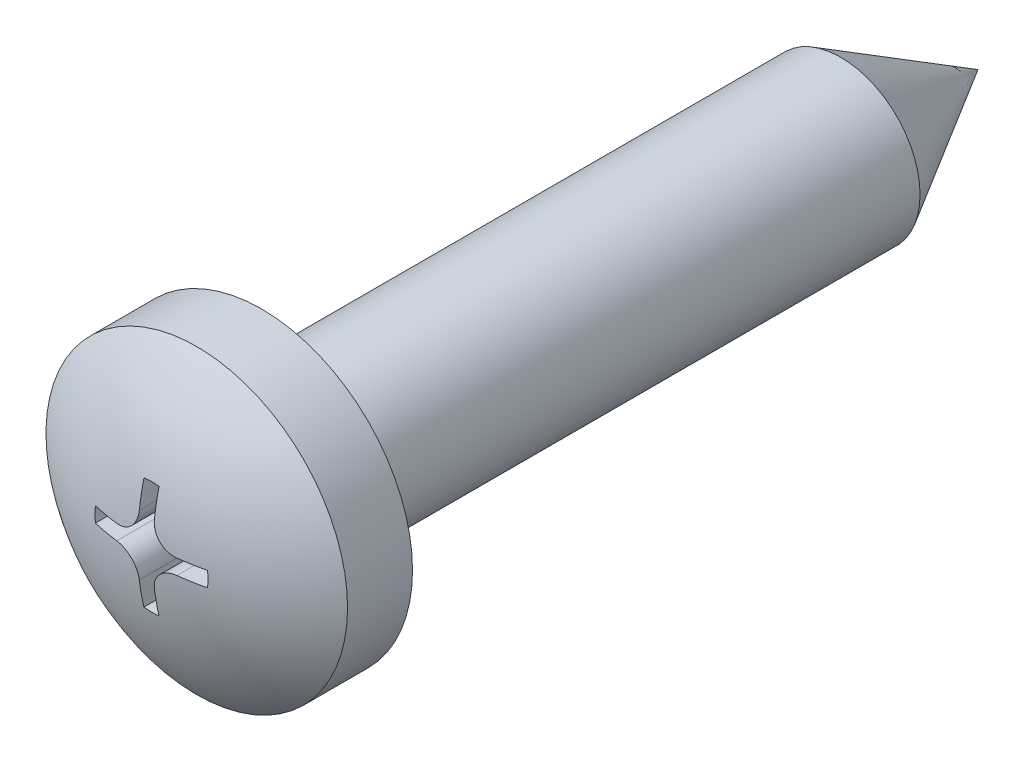
ISO-10303-21;
HEADER;
FILE_DESCRIPTION(('STEP AP214'),'2;1');
FILE_NAME('part.step','',(''),(''),'','','');
FILE_SCHEMA(('AUTOMOTIVE_DESIGN { 1 0 10303 214 1 1 1 1 }'));
ENDSEC;
DATA;
#1=APPLICATION_CONTEXT('core data for automotive mechanical design processes');
#2=APPLICATION_PROTOCOL_DEFINITION('international standard','automotive_design',2000,#1);
#3=PRODUCT_CONTEXT('',#1,'mechanical');
#4=PRODUCT('Part','Part','',(#3));
#5=PRODUCT_RELATED_PRODUCT_CATEGORY('part','',(#4));
#6=PRODUCT_DEFINITION_FORMATION('','',#4);
#7=PRODUCT_DEFINITION_CONTEXT('part definition',#1,'design');
#8=PRODUCT_DEFINITION('design','',#6,#7);
#9=PRODUCT_DEFINITION_SHAPE('','',#8);
#10=(LENGTH_UNIT() NAMED_UNIT(*) SI_UNIT(.MILLI.,.METRE.));
#11=(NAMED_UNIT(*) PLANE_ANGLE_UNIT() SI_UNIT($,.RADIAN.));
#12=(NAMED_UNIT(*) SI_UNIT($,.STERADIAN.) SOLID_ANGLE_UNIT());
#13=UNCERTAINTY_MEASURE_WITH_UNIT(LENGTH_MEASURE(1.E-05),#10,'distance_accuracy_value','');
#14=(GEOMETRIC_REPRESENTATION_CONTEXT(3) GLOBAL_UNCERTAINTY_ASSIGNED_CONTEXT((#13)) GLOBAL_UNIT_ASSIGNED_CONTEXT((#10,
#11,#12)) REPRESENTATION_CONTEXT('',''));
#15=CARTESIAN_POINT('',(0.,0.,0.));
#16=DIRECTION('',(0.,0.,1.));
#17=DIRECTION('',(1.,0.,0.));
#18=AXIS2_PLACEMENT_3D('',#15,#16,#17);
#19=CARTESIAN_POINT('',(0.,0.,15.6));
#20=DIRECTION('',(0.,0.,1.));
#21=DIRECTION('',(0.,1.,0.));
#22=AXIS2_PLACEMENT_3D('',#19,#20,#21);
#23=SPHERICAL_SURFACE('',#22,6.5);
#24=CARTESIAN_POINT('',(0.,0.,20.7234753829798));
#25=DIRECTION('',(0.,0.,1.));
#26=DIRECTION('',(1.,0.,0.));
#27=AXIS2_PLACEMENT_3D('',#24,#25,#26);
#28=CIRCLE('',#27,4.);
#29=CARTESIAN_POINT('',(4.,0.,20.7234753829798));
#30=VERTEX_POINT('',#29);
#31=EDGE_CURVE('E190',#30,#30,#28,.T.);
#32=ORIENTED_EDGE('',*,*,#31,.T.);
#33=EDGE_LOOP('',(#32));
#34=FACE_BOUND('',#33,.T.);
#35=CARTESIAN_POINT('',(0.,0.,21.9245553203368));
#36=DIRECTION('',(0.,0.,-1.));
#37=DIRECTION('',(-1.,0.,0.));
#38=AXIS2_PLACEMENT_3D('',#35,#36,#37);
#39=CIRCLE('',#38,1.5);
#40=CARTESIAN_POINT('',(0.200000000000001,1.48660687473185,21.9245553203368));
#41=VERTEX_POINT('',#40);
#42=CARTESIAN_POINT('',(-0.199999999999999,1.48660687473185,21.9245553203368));
#43=VERTEX_POINT('',#42);
#44=EDGE_CURVE('E298',#41,#43,#39,.F.);
#45=ORIENTED_EDGE('',*,*,#44,.F.);
#46=CARTESIAN_POINT('',(0.200000000000001,0.,15.6));
#47=DIRECTION('',(-1.,0.,0.));
#48=DIRECTION('',(0.,-1.,0.));
#49=AXIS2_PLACEMENT_3D('',#46,#47,#48);
#50=CIRCLE('',#49,6.49692234831231);
#51=CARTESIAN_POINT('',(0.200000000000001,0.797500009462237,22.0477898333388));
#52=VERTEX_POINT('',#51);
#53=EDGE_CURVE('E176',#52,#41,#50,.T.);
#54=ORIENTED_EDGE('',*,*,#53,.F.);
#55=CARTESIAN_POINT('',(0.200000033472805,0.797700009462237,22.0477650919923));
#56=CARTESIAN_POINT('',(0.199959598538046,0.764456004353227,22.0518818702258));
#57=CARTESIAN_POINT('',(0.202750817910161,0.731169020318814,22.0556498737768));
#58=CARTESIAN_POINT('',(0.213830211165421,0.665453235889728,22.0623958966436));
#59=CARTESIAN_POINT('',(0.222116339222608,0.633024120770341,22.065374209394));
#60=CARTESIAN_POINT('',(0.244028273409597,0.569916564069109,22.0704536695397));
#61=CARTESIAN_POINT('',(0.257658395246097,0.539239560456738,22.0725541051388));
#62=CARTESIAN_POINT('',(0.289878258314064,0.480568713011968,22.0758123837552));
#63=CARTESIAN_POINT('',(0.308466342272649,0.452573976833958,22.0769705412201));
#64=CARTESIAN_POINT('',(0.349911737553262,0.400290974802549,22.0783048224275));
#65=CARTESIAN_POINT('',(0.372733211862074,0.375974497150294,22.0784888323926));
#66=CARTESIAN_POINT('',(0.422095682936078,0.331472020678788,22.0778905404286));
#67=CARTESIAN_POINT('',(0.448637220387958,0.311286623335934,22.0771080979026));
#68=CARTESIAN_POINT('',(0.504567937063431,0.275683429833976,22.0746047654783));
#69=CARTESIAN_POINT('',(0.533946629751543,0.260248897721355,22.0728872302717));
#70=CARTESIAN_POINT('',(0.594792537452752,0.234466674321723,22.0685657182236));
#71=CARTESIAN_POINT('',(0.626259020814456,0.224117211583829,22.0659620506138));
#72=CARTESIAN_POINT('',(0.681170677081782,0.210961693981828,22.0608095234174));
#73=CARTESIAN_POINT('',(0.704329791582631,0.206843746812376,22.0584588663086));
#74=CARTESIAN_POINT('',(0.750897403889683,0.201358647922681,22.053383939786));
#75=CARTESIAN_POINT('',(0.774305499469382,0.199987586176354,22.0506602073353));
#76=CARTESIAN_POINT('',(0.797700009462238,0.200000033472804,22.0477650919923));
#77=B_SPLINE_CURVE_WITH_KNOTS('',3,(#55,#56,#57,#58,#59,#60,#61,#62,#63,#64,#65,#66,#67,#68,#69,
#70,#71,#72,#73,#74,#75,#76),.UNSPECIFIED.,.F.,.F.,(4,2,2,2,2,2,2,2,2,2,4),(0.,
0.100373633968193,0.200709918492538,0.301127400130332,0.401511357699248,0.501081398991604,
0.600665927170024,0.69989552274191,0.799090525824951,0.869853043391941,0.940514763005111),.UNSPECIFIED.);
#78=CARTESIAN_POINT('',(0.797500009462238,0.2,22.0477898333388));
#79=VERTEX_POINT('',#78);
#80=EDGE_CURVE('E288',#52,#79,#77,.T.);
#81=ORIENTED_EDGE('',*,*,#80,.T.);
#82=CARTESIAN_POINT('',(0.,0.200000000000002,15.6));
#83=DIRECTION('',(0.,1.,0.));
#84=DIRECTION('',(-1.,0.,0.));
#85=AXIS2_PLACEMENT_3D('',#82,#83,#84);
#86=CIRCLE('',#85,6.49692234831231);
#87=CARTESIAN_POINT('',(1.48660687473185,0.199999999999998,21.9245553203368));
#88=VERTEX_POINT('',#87);
#89=EDGE_CURVE('E296',#79,#88,#86,.T.);
#90=ORIENTED_EDGE('',*,*,#89,.T.);
#91=CARTESIAN_POINT('',(0.,0.,21.9245553203368));
#92=DIRECTION('',(0.,0.,-1.));
#93=DIRECTION('',(-1.,0.,0.));
#94=AXIS2_PLACEMENT_3D('',#91,#92,#93);
#95=CIRCLE('',#94,1.5);
#96=CARTESIAN_POINT('',(1.48660687473185,-0.199999999999998,21.9245553203368));
#97=VERTEX_POINT('',#96);
#98=EDGE_CURVE('E371',#88,#97,#95,.T.);
#99=ORIENTED_EDGE('',*,*,#98,.T.);
#100=CARTESIAN_POINT('',(0.,-0.200000000000002,15.6));
#101=DIRECTION('',(0.,1.,0.));
#102=DIRECTION('',(-1.,0.,0.));
#103=AXIS2_PLACEMENT_3D('',#100,#101,#102);
#104=CIRCLE('',#103,6.49692234831231);
#105=CARTESIAN_POINT('',(0.797500009462238,-0.2,22.0477898333388));
#106=VERTEX_POINT('',#105);
#107=EDGE_CURVE('E260',#106,#97,#104,.T.);
#108=ORIENTED_EDGE('',*,*,#107,.F.);
#109=CARTESIAN_POINT('',(0.200000033472805,-0.797700009462236,22.0477650919923));
#110=CARTESIAN_POINT('',(0.199959598538046,-0.764456004353227,22.0518818702258));
#111=CARTESIAN_POINT('',(0.202750817910161,-0.731169020318814,22.0556498737768));
#112=CARTESIAN_POINT('',(0.213830211165421,-0.665453235889727,22.0623958966436));
#113=CARTESIAN_POINT('',(0.222116339222608,-0.63302412077034,22.065374209394));
#114=CARTESIAN_POINT('',(0.244028273409597,-0.569916564069109,22.0704536695397));
#115=CARTESIAN_POINT('',(0.257658395246097,-0.539239560456737,22.0725541051388));
#116=CARTESIAN_POINT('',(0.289878258314064,-0.480568713011967,22.0758123837552));
#117=CARTESIAN_POINT('',(0.308466342272649,-0.452573976833957,22.0769705412201));
#118=CARTESIAN_POINT('',(0.349911737553262,-0.400290974802549,22.0783048224275));
#119=CARTESIAN_POINT('',(0.372733211862074,-0.375974497150293,22.0784888323926));
#120=CARTESIAN_POINT('',(0.422095682936078,-0.331472020678788,22.0778905404286));
#121=CARTESIAN_POINT('',(0.448637220387958,-0.311286623335934,22.0771080979026));
#122=CARTESIAN_POINT('',(0.504567937063432,-0.275683429833976,22.0746047654783));
#123=CARTESIAN_POINT('',(0.533946629751543,-0.260248897721355,22.0728872302717));
#124=CARTESIAN_POINT('',(0.594792537452753,-0.234466674321723,22.0685657182236));
#125=CARTESIAN_POINT('',(0.626259020814456,-0.224117211583829,22.0659620506138));
#126=CARTESIAN_POINT('',(0.681170677081783,-0.210961693981828,22.0608095234174));
#127=CARTESIAN_POINT('',(0.704329791582631,-0.206843746812376,22.0584588663086));
#128=CARTESIAN_POINT('',(0.750897403889683,-0.201358647922681,22.053383939786));
#129=CARTESIAN_POINT('',(0.774305499469382,-0.199987586176354,22.0506602073353));
#130=CARTESIAN_POINT('',(0.797700009462238,-0.200000033472804,22.0477650919923));
#131=B_SPLINE_CURVE_WITH_KNOTS('',3,(#109,#110,#111,#112,#113,#114,#115,#116,#117,#118,#119,
#120,#121,#122,#123,#124,#125,#126,#127,#128,#129,#130),.UNSPECIFIED.,.F.,.F.,(4,2,2,2,2,2,2,2,
2,2,4),(0.,0.100373633968193,0.200709918492538,0.301127400130332,0.401511357699248,
0.501081398991604,0.600665927170024,0.699895522741911,0.799090525824951,0.869853043391941,
0.94051476300511),.UNSPECIFIED.);
#132=CARTESIAN_POINT('',(0.200000000000001,-0.797500009462237,22.0477898333388));
#133=VERTEX_POINT('',#132);
#134=EDGE_CURVE('E253',#133,#106,#131,.T.);
#135=ORIENTED_EDGE('',*,*,#134,.F.);
#136=CARTESIAN_POINT('',(0.200000000000001,0.,15.6));
#137=DIRECTION('',(1.,0.,0.));
#138=DIRECTION('',(0.,1.,0.));
#139=AXIS2_PLACEMENT_3D('',#136,#137,#138);
#140=CIRCLE('',#139,6.49692234831231);
#141=CARTESIAN_POINT('',(0.200000000000001,-1.48660687473185,21.9245553203368));
#142=VERTEX_POINT('',#141);
#143=EDGE_CURVE('E250',#133,#142,#140,.T.);
#144=ORIENTED_EDGE('',*,*,#143,.T.);
#145=CARTESIAN_POINT('',(0.,0.,21.9245553203368));
#146=DIRECTION('',(0.,0.,-1.));
#147=DIRECTION('',(-1.,0.,0.));
#148=AXIS2_PLACEMENT_3D('',#145,#146,#147);
#149=CIRCLE('',#148,1.5);
#150=CARTESIAN_POINT('',(-0.199999999999999,-1.48660687473185,21.9245553203368));
#151=VERTEX_POINT('',#150);
#152=EDGE_CURVE('E247',#142,#151,#149,.T.);
#153=ORIENTED_EDGE('',*,*,#152,.T.);
#154=CARTESIAN_POINT('',(-0.2,0.,15.6));
#155=DIRECTION('',(1.,0.,0.));
#156=DIRECTION('',(0.,1.,0.));
#157=AXIS2_PLACEMENT_3D('',#154,#155,#156);
#158=CIRCLE('',#157,6.49692234831231);
#159=CARTESIAN_POINT('',(-0.2,-0.797500009462236,22.0477898333388));
#160=VERTEX_POINT('',#159);
#161=EDGE_CURVE('E244',#160,#151,#158,.T.);
#162=ORIENTED_EDGE('',*,*,#161,.F.);
#163=CARTESIAN_POINT('',(-0.200000033472803,-0.797700009462235,22.0477650919923));
#164=CARTESIAN_POINT('',(-0.199959598538045,-0.764456004353225,22.0518818702258));
#165=CARTESIAN_POINT('',(-0.20275081791016,-0.731169020318813,22.0556498737768));
#166=CARTESIAN_POINT('',(-0.21383021116542,-0.665453235889726,22.0623958966436));
#167=CARTESIAN_POINT('',(-0.222116339222606,-0.63302412077034,22.065374209394));
#168=CARTESIAN_POINT('',(-0.244028273409595,-0.569916564069108,22.0704536695397));
#169=CARTESIAN_POINT('',(-0.257658395246095,-0.539239560456737,22.0725541051388));
#170=CARTESIAN_POINT('',(-0.289878258314063,-0.480568713011967,22.0758123837552));
#171=CARTESIAN_POINT('',(-0.308466342272648,-0.452573976833956,22.0769705412201));
#172=CARTESIAN_POINT('',(-0.349911737553261,-0.400290974802548,22.0783048224275));
#173=CARTESIAN_POINT('',(-0.372733211862072,-0.375974497150293,22.0784888323926));
#174=CARTESIAN_POINT('',(-0.422095682936076,-0.331472020678787,22.0778905404286));
#175=CARTESIAN_POINT('',(-0.448637220387957,-0.311286623335933,22.0771080979026));
#176=CARTESIAN_POINT('',(-0.50456793706343,-0.275683429833975,22.0746047654783));
#177=CARTESIAN_POINT('',(-0.533946629751542,-0.260248897721354,22.0728872302717));
#178=CARTESIAN_POINT('',(-0.594792537452751,-0.234466674321722,22.0685657182236));
#179=CARTESIAN_POINT('',(-0.626259020814454,-0.224117211583829,22.0659620506138));
#180=CARTESIAN_POINT('',(-0.681170677081781,-0.210961693981827,22.0608095234174));
#181=CARTESIAN_POINT('',(-0.704329791582629,-0.206843746812375,22.0584588663086));
#182=CARTESIAN_POINT('',(-0.750897403889681,-0.20135864792268,22.053383939786));
#183=CARTESIAN_POINT('',(-0.774305499469379,-0.199987586176354,22.0506602073353));
#184=CARTESIAN_POINT('',(-0.797700009462236,-0.200000033472803,22.0477650919923));
#185=B_SPLINE_CURVE_WITH_KNOTS('',3,(#163,#164,#165,#166,#167,#168,#169,#170,#171,#172,#173,
#174,#175,#176,#177,#178,#179,#180,#181,#182,#183,#184),.UNSPECIFIED.,.F.,.F.,(4,2,2,2,2,2,2,2,
2,2,4),(0.,0.100373633968193,0.200709918492537,0.301127400130332,0.401511357699248,
0.501081398991604,0.600665927170024,0.69989552274191,0.79909052582495,0.86985304339194,
0.940514763005109),.UNSPECIFIED.);
#186=CARTESIAN_POINT('',(-0.797500009462236,-0.199999999999999,22.0477898333388));
#187=VERTEX_POINT('',#186);
#188=EDGE_CURVE('E236',#160,#187,#185,.T.);
#189=ORIENTED_EDGE('',*,*,#188,.T.);
#190=CARTESIAN_POINT('',(0.,-0.2,15.6));
#191=DIRECTION('',(0.,-1.,0.));
#192=DIRECTION('',(1.,0.,0.));
#193=AXIS2_PLACEMENT_3D('',#190,#191,#192);
#194=CIRCLE('',#193,6.49692234831231);
#195=CARTESIAN_POINT('',(-1.48660687473185,-0.199999999999999,21.9245553203368));
#196=VERTEX_POINT('',#195);
#197=EDGE_CURVE('E245',#187,#196,#194,.T.);
#198=ORIENTED_EDGE('',*,*,#197,.T.);
#199=CARTESIAN_POINT('',(0.,0.,21.9245553203368));
#200=DIRECTION('',(0.,0.,-1.));
#201=DIRECTION('',(-1.,0.,0.));
#202=AXIS2_PLACEMENT_3D('',#199,#200,#201);
#203=CIRCLE('',#202,1.5);
#204=CARTESIAN_POINT('',(-1.48660687473185,0.199999999999999,21.9245553203368));
#205=VERTEX_POINT('',#204);
#206=EDGE_CURVE('E410',#205,#196,#203,.F.);
#207=ORIENTED_EDGE('',*,*,#206,.F.);
#208=CARTESIAN_POINT('',(0.,0.2,15.6));
#209=DIRECTION('',(0.,-1.,0.));
#210=DIRECTION('',(1.,0.,0.));
#211=AXIS2_PLACEMENT_3D('',#208,#209,#210);
#212=CIRCLE('',#211,6.49692234831231);
#213=CARTESIAN_POINT('',(-0.797500009462236,0.199999999999999,22.0477898333388));
#214=VERTEX_POINT('',#213);
#215=EDGE_CURVE('E204',#214,#205,#212,.T.);
#216=ORIENTED_EDGE('',*,*,#215,.F.);
#217=CARTESIAN_POINT('',(-0.200000033472804,0.797700009462236,22.0477650919923));
#218=CARTESIAN_POINT('',(-0.199959598538045,0.764456004353226,22.0518818702258));
#219=CARTESIAN_POINT('',(-0.20275081791016,0.731169020318813,22.0556498737768));
#220=CARTESIAN_POINT('',(-0.21383021116542,0.665453235889727,22.0623958966436));
#221=CARTESIAN_POINT('',(-0.222116339222606,0.63302412077034,22.065374209394));
#222=CARTESIAN_POINT('',(-0.244028273409595,0.569916564069108,22.0704536695397));
#223=CARTESIAN_POINT('',(-0.257658395246095,0.539239560456737,22.0725541051388));
#224=CARTESIAN_POINT('',(-0.289878258314063,0.480568713011967,22.0758123837552));
#225=CARTESIAN_POINT('',(-0.308466342272648,0.452573976833957,22.0769705412201));
#226=CARTESIAN_POINT('',(-0.349911737553261,0.400290974802548,22.0783048224275));
#227=CARTESIAN_POINT('',(-0.372733211862072,0.375974497150293,22.0784888323926));
#228=CARTESIAN_POINT('',(-0.422095682936076,0.331472020678787,22.0778905404286));
#229=CARTESIAN_POINT('',(-0.448637220387957,0.311286623335933,22.0771080979026));
#230=CARTESIAN_POINT('',(-0.50456793706343,0.275683429833975,22.0746047654783));
#231=CARTESIAN_POINT('',(-0.533946629751542,0.260248897721354,22.0728872302717));
#232=CARTESIAN_POINT('',(-0.594792537452751,0.234466674321722,22.0685657182236));
#233=CARTESIAN_POINT('',(-0.626259020814454,0.224117211583828,22.0659620506138));
#234=CARTESIAN_POINT('',(-0.681170677081781,0.210961693981827,22.0608095234174));
#235=CARTESIAN_POINT('',(-0.704329791582629,0.206843746812375,22.0584588663086));
#236=CARTESIAN_POINT('',(-0.750897403889681,0.20135864792268,22.053383939786));
#237=CARTESIAN_POINT('',(-0.774305499469379,0.199987586176354,22.0506602073353));
#238=CARTESIAN_POINT('',(-0.797700009462236,0.200000033472803,22.0477650919923));
#239=B_SPLINE_CURVE_WITH_KNOTS('',3,(#217,#218,#219,#220,#221,#222,#223,#224,#225,#226,#227,
#228,#229,#230,#231,#232,#233,#234,#235,#236,#237,#238),.UNSPECIFIED.,.F.,.F.,(4,2,2,2,2,2,2,2,
2,2,4),(0.,0.100373633968193,0.200709918492538,0.301127400130332,0.401511357699248,
0.501081398991604,0.600665927170024,0.69989552274191,0.799090525824951,0.869853043391941,
0.940514763005109),.UNSPECIFIED.);
#240=CARTESIAN_POINT('',(-0.2,0.797500009462236,22.0477898333388));
#241=VERTEX_POINT('',#240);
#242=EDGE_CURVE('E196',#241,#214,#239,.T.);
#243=ORIENTED_EDGE('',*,*,#242,.F.);
#244=CARTESIAN_POINT('',(-0.2,0.,15.6));
#245=DIRECTION('',(-1.,0.,0.));
#246=DIRECTION('',(0.,-1.,0.));
#247=AXIS2_PLACEMENT_3D('',#244,#245,#246);
#248=CIRCLE('',#247,6.49692234831231);
#249=EDGE_CURVE('E193',#241,#43,#248,.T.);
#250=ORIENTED_EDGE('',*,*,#249,.T.);
#251=EDGE_LOOP('',(#45,#54,#81,#90,#99,#108,#135,#144,#153,#162,#189,#198,#207,#216,#243,#250));
#252=FACE_BOUND('',#251,.T.);
#253=ADVANCED_FACE('F41',(#34,#252),#23,.T.);
#254=CARTESIAN_POINT('',(0.,0.,0.));
#255=DIRECTION('',(0.,0.,1.));
#256=DIRECTION('',(1.,0.,0.));
#257=AXIS2_PLACEMENT_3D('',#254,#255,#256);
#258=CONICAL_SURFACE('',#257,0.,0.523598775598293);
#259=CARTESIAN_POINT('',(0.,0.,3.63730669589469));
#260=DIRECTION('',(0.,0.,1.));
#261=DIRECTION('',(1.,0.,0.));
#262=AXIS2_PLACEMENT_3D('',#259,#260,#261);
#263=CIRCLE('',#262,2.1);
#264=CARTESIAN_POINT('',(2.1,0.,3.63730669589469));
#265=VERTEX_POINT('',#264);
#266=EDGE_CURVE('E177',#265,#265,#263,.T.);
#267=ORIENTED_EDGE('',*,*,#266,.F.);
#268=EDGE_LOOP('',(#267));
#269=FACE_BOUND('',#268,.T.);
#270=CARTESIAN_POINT('',(0.,0.,0.));
#271=VERTEX_POINT('',#270);
#272=VERTEX_LOOP('',#271);
#273=FACE_BOUND('',#272,.T.);
#274=ADVANCED_FACE('F312',(#269,#273),#258,.T.);
#275=CARTESIAN_POINT('',(0.,0.,11.71));
#276=DIRECTION('',(0.,0.,1.));
#277=DIRECTION('',(1.,0.,0.));
#278=AXIS2_PLACEMENT_3D('',#275,#276,#277);
#279=CYLINDRICAL_SURFACE('',#278,4.);
#280=ORIENTED_EDGE('',*,*,#31,.F.);
#281=EDGE_LOOP('',(#280));
#282=FACE_BOUND('',#281,.T.);
#283=CARTESIAN_POINT('',(0.,0.,19.));
#284=DIRECTION('',(0.,0.,1.));
#285=DIRECTION('',(1.,0.,0.));
#286=AXIS2_PLACEMENT_3D('',#283,#284,#285);
#287=CIRCLE('',#286,4.);
#288=CARTESIAN_POINT('',(4.,0.,19.));
#289=VERTEX_POINT('',#288);
#290=EDGE_CURVE('E181',#289,#289,#287,.T.);
#291=ORIENTED_EDGE('',*,*,#290,.T.);
#292=EDGE_LOOP('',(#291));
#293=FACE_BOUND('',#292,.T.);
#294=ADVANCED_FACE('F317',(#282,#293),#279,.T.);
#295=CARTESIAN_POINT('',(0.,4.,19.));
#296=DIRECTION('',(0.,0.,1.));
#297=DIRECTION('',(1.,0.,0.));
#298=AXIS2_PLACEMENT_3D('',#295,#296,#297);
#299=PLANE('',#298);
#300=CARTESIAN_POINT('',(0.,0.,19.));
#301=DIRECTION('',(0.,0.,1.));
#302=DIRECTION('',(1.,0.,0.));
#303=AXIS2_PLACEMENT_3D('',#300,#301,#302);
#304=CIRCLE('',#303,2.3);
#305=CARTESIAN_POINT('',(2.3,0.,19.));
#306=VERTEX_POINT('',#305);
#307=EDGE_CURVE('E50',#306,#306,#304,.T.);
#308=ORIENTED_EDGE('',*,*,#307,.T.);
#309=EDGE_LOOP('',(#308));
#310=FACE_BOUND('',#309,.T.);
#311=ORIENTED_EDGE('',*,*,#290,.F.);
#312=EDGE_LOOP('',(#311));
#313=FACE_BOUND('',#312,.T.);
#314=ADVANCED_FACE('F302',(#310,#313),#299,.F.);
#315=CARTESIAN_POINT('',(0.,0.,11.71));
#316=DIRECTION('',(0.,0.,1.));
#317=DIRECTION('',(1.,0.,0.));
#318=AXIS2_PLACEMENT_3D('',#315,#316,#317);
#319=CYLINDRICAL_SURFACE('',#318,2.1);
#320=CARTESIAN_POINT('',(0.,0.,18.8));
#321=DIRECTION('',(0.,0.,1.));
#322=DIRECTION('',(1.,0.,0.));
#323=AXIS2_PLACEMENT_3D('',#320,#321,#322);
#324=CIRCLE('',#323,2.1);
#325=CARTESIAN_POINT('',(2.1,0.,18.8));
#326=VERTEX_POINT('',#325);
#327=EDGE_CURVE('E11',#326,#326,#324,.F.);
#328=ORIENTED_EDGE('',*,*,#327,.T.);
#329=EDGE_LOOP('',(#328));
#330=FACE_BOUND('',#329,.T.);
#331=ORIENTED_EDGE('',*,*,#266,.T.);
#332=EDGE_LOOP('',(#331));
#333=FACE_BOUND('',#332,.T.);
#334=ADVANCED_FACE('F464',(#330,#333),#319,.T.);
#335=CARTESIAN_POINT('',(0.,0.,20.3));
#336=DIRECTION('',(0.,0.,1.));
#337=DIRECTION('',(1.,0.,0.));
#338=AXIS2_PLACEMENT_3D('',#335,#336,#337);
#339=CYLINDRICAL_SURFACE('',#338,1.5);
#340=ORIENTED_EDGE('',*,*,#44,.T.);
#341=DIRECTION('',(0.,0.,1.));
#342=VECTOR('',#341,1.);
#343=CARTESIAN_POINT('',(-0.199999999999999,1.48660687473185,20.3));
#344=LINE('',#343,#342);
#345=CARTESIAN_POINT('',(-0.199999999999999,1.48660687473185,20.3));
#346=VERTEX_POINT('',#345);
#347=EDGE_CURVE('E57',#346,#43,#344,.T.);
#348=ORIENTED_EDGE('',*,*,#347,.F.);
#349=CARTESIAN_POINT('',(0.,0.,20.3));
#350=DIRECTION('',(0.,0.,-1.));
#351=DIRECTION('',(-1.,0.,0.));
#352=AXIS2_PLACEMENT_3D('',#349,#350,#351);
#353=CIRCLE('',#352,1.5);
#354=CARTESIAN_POINT('',(0.200000000000001,1.48660687473185,20.3));
#355=VERTEX_POINT('',#354);
#356=EDGE_CURVE('E159',#346,#355,#353,.T.);
#357=ORIENTED_EDGE('',*,*,#356,.T.);
#358=DIRECTION('',(0.,0.,1.));
#359=VECTOR('',#358,1.);
#360=CARTESIAN_POINT('',(0.200000000000001,1.48660687473185,20.3));
#361=LINE('',#360,#359);
#362=EDGE_CURVE('E171',#355,#41,#361,.T.);
#363=ORIENTED_EDGE('',*,*,#362,.T.);
#364=EDGE_LOOP('',(#340,#348,#357,#363));
#365=FACE_BOUND('',#364,.T.);
#366=ADVANCED_FACE('F170',(#365),#339,.F.);
#367=CARTESIAN_POINT('',(0.200000000000001,1.48660687473185,20.3));
#368=DIRECTION('',(-1.,0.,0.));
#369=DIRECTION('',(0.,-1.,0.));
#370=AXIS2_PLACEMENT_3D('',#367,#368,#369);
#371=PLANE('',#370);
#372=ORIENTED_EDGE('',*,*,#53,.T.);
#373=ORIENTED_EDGE('',*,*,#362,.F.);
#374=DIRECTION('',(0.,-1.,0.));
#375=VECTOR('',#374,1.);
#376=CARTESIAN_POINT('',(0.200000000000001,1.48660687473185,20.3));
#377=LINE('',#376,#375);
#378=CARTESIAN_POINT('',(0.200000000000001,0.797500009462237,20.3));
#379=VERTEX_POINT('',#378);
#380=EDGE_CURVE('E155',#355,#379,#377,.T.);
#381=ORIENTED_EDGE('',*,*,#380,.T.);
#382=DIRECTION('',(0.,0.,1.));
#383=VECTOR('',#382,1.);
#384=CARTESIAN_POINT('',(0.200000000000001,0.797500009462237,20.3));
#385=LINE('',#384,#383);
#386=EDGE_CURVE('E178',#379,#52,#385,.T.);
#387=ORIENTED_EDGE('',*,*,#386,.T.);
#388=EDGE_LOOP('',(#372,#373,#381,#387));
#389=FACE_BOUND('',#388,.T.);
#390=ADVANCED_FACE('F174',(#389),#371,.T.);
#391=CARTESIAN_POINT('',(0.797500009462238,0.797500009462237,20.3));
#392=DIRECTION('',(0.,0.,1.));
#393=DIRECTION('',(1.,0.,0.));
#394=AXIS2_PLACEMENT_3D('',#391,#392,#393);
#395=CYLINDRICAL_SURFACE('',#394,0.597500009462237);
#396=ORIENTED_EDGE('',*,*,#386,.F.);
#397=CARTESIAN_POINT('',(0.797500009462238,0.797500009462237,20.3));
#398=DIRECTION('',(0.,0.,-1.));
#399=DIRECTION('',(-1.,0.,0.));
#400=AXIS2_PLACEMENT_3D('',#397,#398,#399);
#401=CIRCLE('',#400,0.597500009462237);
#402=CARTESIAN_POINT('',(0.797500009462238,0.2,20.3));
#403=VERTEX_POINT('',#402);
#404=EDGE_CURVE('E162',#403,#379,#401,.T.);
#405=ORIENTED_EDGE('',*,*,#404,.F.);
#406=DIRECTION('',(0.,0.,1.));
#407=VECTOR('',#406,1.);
#408=CARTESIAN_POINT('',(0.797500009462238,0.2,20.3));
#409=LINE('',#408,#407);
#410=EDGE_CURVE('E183',#403,#79,#409,.T.);
#411=ORIENTED_EDGE('',*,*,#410,.T.);
#412=ORIENTED_EDGE('',*,*,#80,.F.);
#413=EDGE_LOOP('',(#396,#405,#411,#412));
#414=FACE_BOUND('',#413,.T.);
#415=ADVANCED_FACE('F280',(#414),#395,.T.);
#416=CARTESIAN_POINT('',(1.48660687473185,0.199999999999998,20.3));
#417=DIRECTION('',(0.,1.,0.));
#418=DIRECTION('',(-1.,0.,0.));
#419=AXIS2_PLACEMENT_3D('',#416,#417,#418);
#420=PLANE('',#419);
#421=ORIENTED_EDGE('',*,*,#410,.F.);
#422=DIRECTION('',(-1.,0.,0.));
#423=VECTOR('',#422,1.);
#424=CARTESIAN_POINT('',(1.48660687473185,0.199999999999998,20.3));
#425=LINE('',#424,#423);
#426=CARTESIAN_POINT('',(1.48660687473185,0.199999999999998,20.3));
#427=VERTEX_POINT('',#426);
#428=EDGE_CURVE('E379',#427,#403,#425,.T.);
#429=ORIENTED_EDGE('',*,*,#428,.F.);
#430=DIRECTION('',(0.,0.,1.));
#431=VECTOR('',#430,1.);
#432=CARTESIAN_POINT('',(1.48660687473185,0.199999999999998,20.3));
#433=LINE('',#432,#431);
#434=EDGE_CURVE('E364',#427,#88,#433,.T.);
#435=ORIENTED_EDGE('',*,*,#434,.T.);
#436=ORIENTED_EDGE('',*,*,#89,.F.);
#437=EDGE_LOOP('',(#421,#429,#435,#436));
#438=FACE_BOUND('',#437,.T.);
#439=ADVANCED_FACE('F276',(#438),#420,.F.);
#440=CARTESIAN_POINT('',(0.,0.,20.3));
#441=DIRECTION('',(0.,0.,1.));
#442=DIRECTION('',(1.,0.,0.));
#443=AXIS2_PLACEMENT_3D('',#440,#441,#442);
#444=CYLINDRICAL_SURFACE('',#443,1.5);
#445=ORIENTED_EDGE('',*,*,#434,.F.);
#446=CARTESIAN_POINT('',(0.,0.,20.3));
#447=DIRECTION('',(0.,0.,1.));
#448=DIRECTION('',(1.,0.,0.));
#449=AXIS2_PLACEMENT_3D('',#446,#447,#448);
#450=CIRCLE('',#449,1.5);
#451=CARTESIAN_POINT('',(1.48660687473185,-0.199999999999999,20.3));
#452=VERTEX_POINT('',#451);
#453=EDGE_CURVE('E377',#452,#427,#450,.T.);
#454=ORIENTED_EDGE('',*,*,#453,.F.);
#455=DIRECTION('',(0.,0.,1.));
#456=VECTOR('',#455,1.);
#457=CARTESIAN_POINT('',(1.48660687473185,-0.199999999999999,20.3));
#458=LINE('',#457,#456);
#459=EDGE_CURVE('E361',#452,#97,#458,.T.);
#460=ORIENTED_EDGE('',*,*,#459,.T.);
#461=ORIENTED_EDGE('',*,*,#98,.F.);
#462=EDGE_LOOP('',(#445,#454,#460,#461));
#463=FACE_BOUND('',#462,.T.);
#464=ADVANCED_FACE('F272',(#463),#444,.F.);
#465=CARTESIAN_POINT('',(1.48660687473185,-0.199999999999998,20.3));
#466=DIRECTION('',(0.,1.,0.));
#467=DIRECTION('',(-1.,0.,0.));
#468=AXIS2_PLACEMENT_3D('',#465,#466,#467);
#469=PLANE('',#468);
#470=ORIENTED_EDGE('',*,*,#107,.T.);
#471=ORIENTED_EDGE('',*,*,#459,.F.);
#472=DIRECTION('',(-1.,0.,0.));
#473=VECTOR('',#472,1.);
#474=CARTESIAN_POINT('',(1.48660687473185,-0.199999999999998,20.3));
#475=LINE('',#474,#473);
#476=CARTESIAN_POINT('',(0.797500009462238,-0.2,20.3));
#477=VERTEX_POINT('',#476);
#478=EDGE_CURVE('E378',#452,#477,#475,.T.);
#479=ORIENTED_EDGE('',*,*,#478,.T.);
#480=DIRECTION('',(0.,0.,1.));
#481=VECTOR('',#480,1.);
#482=CARTESIAN_POINT('',(0.797500009462238,-0.2,20.3));
#483=LINE('',#482,#481);
#484=EDGE_CURVE('E358',#477,#106,#483,.T.);
#485=ORIENTED_EDGE('',*,*,#484,.T.);
#486=EDGE_LOOP('',(#470,#471,#479,#485));
#487=FACE_BOUND('',#486,.T.);
#488=ADVANCED_FACE('F268',(#487),#469,.T.);
#489=CARTESIAN_POINT('',(0.797500009462238,-0.797500009462237,20.3));
#490=DIRECTION('',(0.,0.,1.));
#491=DIRECTION('',(1.,0.,0.));
#492=AXIS2_PLACEMENT_3D('',#489,#490,#491);
#493=CYLINDRICAL_SURFACE('',#492,0.597500009462237);
#494=ORIENTED_EDGE('',*,*,#134,.T.);
#495=ORIENTED_EDGE('',*,*,#484,.F.);
#496=CARTESIAN_POINT('',(0.797500009462238,-0.797500009462237,20.3));
#497=DIRECTION('',(0.,0.,1.));
#498=DIRECTION('',(1.,0.,0.));
#499=AXIS2_PLACEMENT_3D('',#496,#497,#498);
#500=CIRCLE('',#499,0.597500009462237);
#501=CARTESIAN_POINT('',(0.200000000000001,-0.797500009462237,20.3));
#502=VERTEX_POINT('',#501);
#503=EDGE_CURVE('E381',#477,#502,#500,.T.);
#504=ORIENTED_EDGE('',*,*,#503,.T.);
#505=DIRECTION('',(0.,0.,1.));
#506=VECTOR('',#505,1.);
#507=CARTESIAN_POINT('',(0.200000000000001,-0.797500009462237,20.3));
#508=LINE('',#507,#506);
#509=EDGE_CURVE('E355',#502,#133,#508,.T.);
#510=ORIENTED_EDGE('',*,*,#509,.T.);
#511=EDGE_LOOP('',(#494,#495,#504,#510));
#512=FACE_BOUND('',#511,.T.);
#513=ADVANCED_FACE('F262',(#512),#493,.T.);
#514=CARTESIAN_POINT('',(0.200000000000001,-1.48660687473185,20.3));
#515=DIRECTION('',(1.,0.,0.));
#516=DIRECTION('',(0.,1.,0.));
#517=AXIS2_PLACEMENT_3D('',#514,#515,#516);
#518=PLANE('',#517);
#519=ORIENTED_EDGE('',*,*,#509,.F.);
#520=DIRECTION('',(0.,1.,0.));
#521=VECTOR('',#520,1.);
#522=CARTESIAN_POINT('',(0.200000000000001,-1.48660687473185,20.3));
#523=LINE('',#522,#521);
#524=CARTESIAN_POINT('',(0.200000000000001,-1.48660687473185,20.3));
#525=VERTEX_POINT('',#524);
#526=EDGE_CURVE('E387',#525,#502,#523,.T.);
#527=ORIENTED_EDGE('',*,*,#526,.F.);
#528=DIRECTION('',(0.,0.,1.));
#529=VECTOR('',#528,1.);
#530=CARTESIAN_POINT('',(0.200000000000001,-1.48660687473185,20.3));
#531=LINE('',#530,#529);
#532=EDGE_CURVE('E352',#525,#142,#531,.T.);
#533=ORIENTED_EDGE('',*,*,#532,.T.);
#534=ORIENTED_EDGE('',*,*,#143,.F.);
#535=EDGE_LOOP('',(#519,#527,#533,#534));
#536=FACE_BOUND('',#535,.T.);
#537=ADVANCED_FACE('F267',(#536),#518,.F.);
#538=CARTESIAN_POINT('',(0.,0.,20.3));
#539=DIRECTION('',(0.,0.,1.));
#540=DIRECTION('',(1.,0.,0.));
#541=AXIS2_PLACEMENT_3D('',#538,#539,#540);
#542=CYLINDRICAL_SURFACE('',#541,1.5);
#543=ORIENTED_EDGE('',*,*,#532,.F.);
#544=CARTESIAN_POINT('',(0.,0.,20.3));
#545=DIRECTION('',(0.,0.,1.));
#546=DIRECTION('',(1.,0.,0.));
#547=AXIS2_PLACEMENT_3D('',#544,#545,#546);
#548=CIRCLE('',#547,1.5);
#549=CARTESIAN_POINT('',(-0.2,-1.48660687473185,20.3));
#550=VERTEX_POINT('',#549);
#551=EDGE_CURVE('E390',#550,#525,#548,.T.);
#552=ORIENTED_EDGE('',*,*,#551,.F.);
#553=DIRECTION('',(0.,0.,1.));
#554=VECTOR('',#553,1.);
#555=CARTESIAN_POINT('',(-0.2,-1.48660687473185,20.3));
#556=LINE('',#555,#554);
#557=EDGE_CURVE('E349',#550,#151,#556,.T.);
#558=ORIENTED_EDGE('',*,*,#557,.T.);
#559=ORIENTED_EDGE('',*,*,#152,.F.);
#560=EDGE_LOOP('',(#543,#552,#558,#559));
#561=FACE_BOUND('',#560,.T.);
#562=ADVANCED_FACE('F419',(#561),#542,.F.);
#563=CARTESIAN_POINT('',(-0.199999999999999,-1.48660687473185,20.3));
#564=DIRECTION('',(1.,0.,0.));
#565=DIRECTION('',(0.,1.,0.));
#566=AXIS2_PLACEMENT_3D('',#563,#564,#565);
#567=PLANE('',#566);
#568=ORIENTED_EDGE('',*,*,#161,.T.);
#569=ORIENTED_EDGE('',*,*,#557,.F.);
#570=DIRECTION('',(0.,1.,0.));
#571=VECTOR('',#570,1.);
#572=CARTESIAN_POINT('',(-0.199999999999999,-1.48660687473185,20.3));
#573=LINE('',#572,#571);
#574=CARTESIAN_POINT('',(-0.2,-0.797500009462236,20.3));
#575=VERTEX_POINT('',#574);
#576=EDGE_CURVE('E393',#550,#575,#573,.T.);
#577=ORIENTED_EDGE('',*,*,#576,.T.);
#578=DIRECTION('',(0.,0.,1.));
#579=VECTOR('',#578,1.);
#580=CARTESIAN_POINT('',(-0.2,-0.797500009462236,20.3));
#581=LINE('',#580,#579);
#582=EDGE_CURVE('E346',#575,#160,#581,.T.);
#583=ORIENTED_EDGE('',*,*,#582,.T.);
#584=EDGE_LOOP('',(#568,#569,#577,#583));
#585=FACE_BOUND('',#584,.T.);
#586=ADVANCED_FACE('F232',(#585),#567,.T.);
#587=CARTESIAN_POINT('',(-0.797500009462237,-0.797500009462236,20.3));
#588=DIRECTION('',(0.,0.,1.));
#589=DIRECTION('',(1.,0.,0.));
#590=AXIS2_PLACEMENT_3D('',#587,#588,#589);
#591=CYLINDRICAL_SURFACE('',#590,0.597500009462237);
#592=ORIENTED_EDGE('',*,*,#582,.F.);
#593=CARTESIAN_POINT('',(-0.797500009462237,-0.797500009462236,20.3));
#594=DIRECTION('',(0.,0.,-1.));
#595=DIRECTION('',(-1.,0.,0.));
#596=AXIS2_PLACEMENT_3D('',#593,#594,#595);
#597=CIRCLE('',#596,0.597500009462237);
#598=CARTESIAN_POINT('',(-0.797500009462236,-0.199999999999999,20.3));
#599=VERTEX_POINT('',#598);
#600=EDGE_CURVE('E395',#599,#575,#597,.T.);
#601=ORIENTED_EDGE('',*,*,#600,.F.);
#602=DIRECTION('',(0.,0.,1.));
#603=VECTOR('',#602,1.);
#604=CARTESIAN_POINT('',(-0.797500009462236,-0.199999999999999,20.3));
#605=LINE('',#604,#603);
#606=EDGE_CURVE('E343',#599,#187,#605,.T.);
#607=ORIENTED_EDGE('',*,*,#606,.T.);
#608=ORIENTED_EDGE('',*,*,#188,.F.);
#609=EDGE_LOOP('',(#592,#601,#607,#608));
#610=FACE_BOUND('',#609,.T.);
#611=ADVANCED_FACE('F227',(#610),#591,.T.);
#612=CARTESIAN_POINT('',(-1.48660687473185,-0.199999999999999,20.3));
#613=DIRECTION('',(0.,-1.,0.));
#614=DIRECTION('',(1.,0.,0.));
#615=AXIS2_PLACEMENT_3D('',#612,#613,#614);
#616=PLANE('',#615);
#617=ORIENTED_EDGE('',*,*,#606,.F.);
#618=DIRECTION('',(1.,0.,0.));
#619=VECTOR('',#618,1.);
#620=CARTESIAN_POINT('',(-1.48660687473185,-0.199999999999999,20.3));
#621=LINE('',#620,#619);
#622=CARTESIAN_POINT('',(-1.48660687473185,-0.199999999999999,20.3));
#623=VERTEX_POINT('',#622);
#624=EDGE_CURVE('E398',#623,#599,#621,.T.);
#625=ORIENTED_EDGE('',*,*,#624,.F.);
#626=DIRECTION('',(0.,0.,1.));
#627=VECTOR('',#626,1.);
#628=CARTESIAN_POINT('',(-1.48660687473185,-0.199999999999999,20.3));
#629=LINE('',#628,#627);
#630=EDGE_CURVE('E340',#623,#196,#629,.T.);
#631=ORIENTED_EDGE('',*,*,#630,.T.);
#632=ORIENTED_EDGE('',*,*,#197,.F.);
#633=EDGE_LOOP('',(#617,#625,#631,#632));
#634=FACE_BOUND('',#633,.T.);
#635=ADVANCED_FACE('F223',(#634),#616,.F.);
#636=CARTESIAN_POINT('',(0.,0.,20.3));
#637=DIRECTION('',(0.,0.,1.));
#638=DIRECTION('',(1.,0.,0.));
#639=AXIS2_PLACEMENT_3D('',#636,#637,#638);
#640=CYLINDRICAL_SURFACE('',#639,1.5);
#641=ORIENTED_EDGE('',*,*,#206,.T.);
#642=ORIENTED_EDGE('',*,*,#630,.F.);
#643=CARTESIAN_POINT('',(0.,0.,20.3));
#644=DIRECTION('',(0.,0.,-1.));
#645=DIRECTION('',(-1.,0.,0.));
#646=AXIS2_PLACEMENT_3D('',#643,#644,#645);
#647=CIRCLE('',#646,1.5);
#648=CARTESIAN_POINT('',(-1.48660687473185,0.199999999999998,20.3));
#649=VERTEX_POINT('',#648);
#650=EDGE_CURVE('E401',#623,#649,#647,.T.);
#651=ORIENTED_EDGE('',*,*,#650,.T.);
#652=DIRECTION('',(0.,0.,1.));
#653=VECTOR('',#652,1.);
#654=CARTESIAN_POINT('',(-1.48660687473185,0.199999999999998,20.3));
#655=LINE('',#654,#653);
#656=EDGE_CURVE('E332',#649,#205,#655,.T.);
#657=ORIENTED_EDGE('',*,*,#656,.T.);
#658=EDGE_LOOP('',(#641,#642,#651,#657));
#659=FACE_BOUND('',#658,.T.);
#660=ADVANCED_FACE('F219',(#659),#640,.F.);
#661=CARTESIAN_POINT('',(-1.48660687473185,0.199999999999999,20.3));
#662=DIRECTION('',(0.,-1.,0.));
#663=DIRECTION('',(1.,0.,0.));
#664=AXIS2_PLACEMENT_3D('',#661,#662,#663);
#665=PLANE('',#664);
#666=ORIENTED_EDGE('',*,*,#215,.T.);
#667=ORIENTED_EDGE('',*,*,#656,.F.);
#668=DIRECTION('',(1.,0.,0.));
#669=VECTOR('',#668,1.);
#670=CARTESIAN_POINT('',(-1.48660687473185,0.199999999999999,20.3));
#671=LINE('',#670,#669);
#672=CARTESIAN_POINT('',(-0.797500009462236,0.199999999999999,20.3));
#673=VERTEX_POINT('',#672);
#674=EDGE_CURVE('E403',#649,#673,#671,.T.);
#675=ORIENTED_EDGE('',*,*,#674,.T.);
#676=DIRECTION('',(0.,0.,1.));
#677=VECTOR('',#676,1.);
#678=CARTESIAN_POINT('',(-0.797500009462236,0.199999999999999,20.3));
#679=LINE('',#678,#677);
#680=EDGE_CURVE('E330',#673,#214,#679,.T.);
#681=ORIENTED_EDGE('',*,*,#680,.T.);
#682=EDGE_LOOP('',(#666,#667,#675,#681));
#683=FACE_BOUND('',#682,.T.);
#684=ADVANCED_FACE('F214',(#683),#665,.T.);
#685=CARTESIAN_POINT('',(-0.797500009462237,0.797500009462236,20.3));
#686=DIRECTION('',(0.,0.,1.));
#687=DIRECTION('',(1.,0.,0.));
#688=AXIS2_PLACEMENT_3D('',#685,#686,#687);
#689=CYLINDRICAL_SURFACE('',#688,0.597500009462237);
#690=ORIENTED_EDGE('',*,*,#242,.T.);
#691=ORIENTED_EDGE('',*,*,#680,.F.);
#692=CARTESIAN_POINT('',(-0.797500009462237,0.797500009462236,20.3));
#693=DIRECTION('',(0.,0.,1.));
#694=DIRECTION('',(1.,0.,0.));
#695=AXIS2_PLACEMENT_3D('',#692,#693,#694);
#696=CIRCLE('',#695,0.597500009462237);
#697=CARTESIAN_POINT('',(-0.2,0.797500009462236,20.3));
#698=VERTEX_POINT('',#697);
#699=EDGE_CURVE('E329',#673,#698,#696,.T.);
#700=ORIENTED_EDGE('',*,*,#699,.T.);
#701=DIRECTION('',(0.,0.,1.));
#702=VECTOR('',#701,1.);
#703=CARTESIAN_POINT('',(-0.2,0.797500009462236,20.3));
#704=LINE('',#703,#702);
#705=EDGE_CURVE('E325',#698,#241,#704,.T.);
#706=ORIENTED_EDGE('',*,*,#705,.T.);
#707=EDGE_LOOP('',(#690,#691,#700,#706));
#708=FACE_BOUND('',#707,.T.);
#709=ADVANCED_FACE('F208',(#708),#689,.T.);
#710=CARTESIAN_POINT('',(-0.199999999999999,1.48660687473185,20.3));
#711=DIRECTION('',(-1.,0.,0.));
#712=DIRECTION('',(0.,-1.,0.));
#713=AXIS2_PLACEMENT_3D('',#710,#711,#712);
#714=PLANE('',#713);
#715=ORIENTED_EDGE('',*,*,#705,.F.);
#716=DIRECTION('',(0.,-1.,0.));
#717=VECTOR('',#716,1.);
#718=CARTESIAN_POINT('',(-0.199999999999999,1.48660687473185,20.3));
#719=LINE('',#718,#717);
#720=EDGE_CURVE('E334',#346,#698,#719,.T.);
#721=ORIENTED_EDGE('',*,*,#720,.F.);
#722=ORIENTED_EDGE('',*,*,#347,.T.);
#723=ORIENTED_EDGE('',*,*,#249,.F.);
#724=EDGE_LOOP('',(#715,#721,#722,#723));
#725=FACE_BOUND('',#724,.T.);
#726=ADVANCED_FACE('F213',(#725),#714,.F.);
#727=CARTESIAN_POINT('',(0.,0.,20.3));
#728=DIRECTION('',(0.,0.,-1.));
#729=DIRECTION('',(-1.,0.,0.));
#730=AXIS2_PLACEMENT_3D('',#727,#728,#729);
#731=PLANE('',#730);
#732=ORIENTED_EDGE('',*,*,#356,.F.);
#733=ORIENTED_EDGE('',*,*,#720,.T.);
#734=ORIENTED_EDGE('',*,*,#699,.F.);
#735=ORIENTED_EDGE('',*,*,#674,.F.);
#736=ORIENTED_EDGE('',*,*,#650,.F.);
#737=ORIENTED_EDGE('',*,*,#624,.T.);
#738=ORIENTED_EDGE('',*,*,#600,.T.);
#739=ORIENTED_EDGE('',*,*,#576,.F.);
#740=ORIENTED_EDGE('',*,*,#551,.T.);
#741=ORIENTED_EDGE('',*,*,#526,.T.);
#742=ORIENTED_EDGE('',*,*,#503,.F.);
#743=ORIENTED_EDGE('',*,*,#478,.F.);
#744=ORIENTED_EDGE('',*,*,#453,.T.);
#745=ORIENTED_EDGE('',*,*,#428,.T.);
#746=ORIENTED_EDGE('',*,*,#404,.T.);
#747=ORIENTED_EDGE('',*,*,#380,.F.);
#748=EDGE_LOOP('',(#732,#733,#734,#735,#736,#737,#738,#739,#740,#741,#742,#743,#744,#745,#746,#747));
#749=FACE_BOUND('',#748,.T.);
#750=ADVANCED_FACE('F157',(#749),#731,.F.);
#751=CARTESIAN_POINT('',(0.,0.,18.8));
#752=DIRECTION('',(0.,0.,1.));
#753=DIRECTION('',(1.,0.,0.));
#754=AXIS2_PLACEMENT_3D('',#751,#752,#753);
#755=TOROIDAL_SURFACE('',#754,2.3,0.2);
#756=ORIENTED_EDGE('',*,*,#327,.F.);
#757=EDGE_LOOP('',(#756));
#758=FACE_BOUND('',#757,.T.);
#759=ORIENTED_EDGE('',*,*,#307,.F.);
#760=EDGE_LOOP('',(#759));
#761=FACE_BOUND('',#760,.T.);
#762=ADVANCED_FACE('F43',(#758,#761),#755,.F.);
#763=CLOSED_SHELL('',(#253,#274,#294,#314,#334,#366,#390,#415,#439,#464,#488,#513,#537,#562,
#586,#611,#635,#660,#684,#709,#726,#750,#762));
#764=MANIFOLD_SOLID_BREP('B2',#763);
#765=ADVANCED_BREP_SHAPE_REPRESENTATION('',(#18,#764),#14);
#766=SHAPE_DEFINITION_REPRESENTATION(#9,#765);
ENDSEC;
END-ISO-10303-21;
